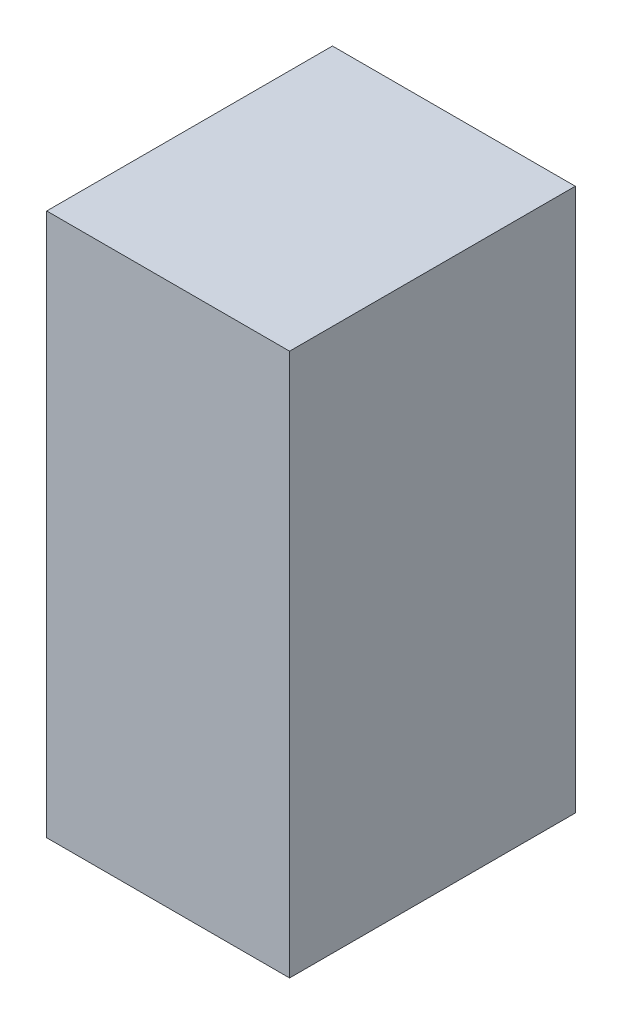
ISO-10303-21;
HEADER;
FILE_DESCRIPTION(('STEP AP214'),'2;1');
FILE_NAME('part.step','',(''),(''),'','','');
FILE_SCHEMA(('AUTOMOTIVE_DESIGN { 1 0 10303 214 1 1 1 1 }'));
ENDSEC;
DATA;
#1=APPLICATION_CONTEXT('core data for automotive mechanical design processes');
#2=APPLICATION_PROTOCOL_DEFINITION('international standard','automotive_design',2000,#1);
#3=PRODUCT_CONTEXT('',#1,'mechanical');
#4=PRODUCT('Part','Part','',(#3));
#5=PRODUCT_RELATED_PRODUCT_CATEGORY('part','',(#4));
#6=PRODUCT_DEFINITION_FORMATION('','',#4);
#7=PRODUCT_DEFINITION_CONTEXT('part definition',#1,'design');
#8=PRODUCT_DEFINITION('design','',#6,#7);
#9=PRODUCT_DEFINITION_SHAPE('','',#8);
#10=(LENGTH_UNIT() NAMED_UNIT(*) SI_UNIT(.MILLI.,.METRE.));
#11=(NAMED_UNIT(*) PLANE_ANGLE_UNIT() SI_UNIT($,.RADIAN.));
#12=(NAMED_UNIT(*) SI_UNIT($,.STERADIAN.) SOLID_ANGLE_UNIT());
#13=UNCERTAINTY_MEASURE_WITH_UNIT(LENGTH_MEASURE(1.E-05),#10,'distance_accuracy_value','');
#14=(GEOMETRIC_REPRESENTATION_CONTEXT(3) GLOBAL_UNCERTAINTY_ASSIGNED_CONTEXT((#13)) GLOBAL_UNIT_ASSIGNED_CONTEXT((#10,
#11,#12)) REPRESENTATION_CONTEXT('',''));
#15=CARTESIAN_POINT('',(0.,0.,0.));
#16=DIRECTION('',(0.,0.,1.));
#17=DIRECTION('',(1.,0.,0.));
#18=AXIS2_PLACEMENT_3D('',#15,#16,#17);
#19=CARTESIAN_POINT('',(0.0425000000000041,0.0950000000000074,0.1));
#20=DIRECTION('',(-1.,0.,0.));
#21=DIRECTION('',(0.,-1.,0.));
#22=AXIS2_PLACEMENT_3D('',#19,#20,#21);
#23=PLANE('',#22);
#24=DIRECTION('',(0.,1.,0.));
#25=VECTOR('',#24,1.);
#26=CARTESIAN_POINT('',(0.0425000000000041,0.0950000000000074,0.));
#27=LINE('',#26,#25);
#28=CARTESIAN_POINT('',(0.0425000000000041,-0.0950000000000074,0.));
#29=VERTEX_POINT('',#28);
#30=CARTESIAN_POINT('',(0.0425000000000041,0.0950000000000074,0.));
#31=VERTEX_POINT('',#30);
#32=EDGE_CURVE('E107',#29,#31,#27,.T.);
#33=ORIENTED_EDGE('',*,*,#32,.T.);
#34=DIRECTION('',(0.,0.,-1.));
#35=VECTOR('',#34,1.);
#36=CARTESIAN_POINT('',(0.0425000000000041,0.0950000000000074,0.1));
#37=LINE('',#36,#35);
#38=CARTESIAN_POINT('',(0.0425000000000041,0.0950000000000074,0.1));
#39=VERTEX_POINT('',#38);
#40=EDGE_CURVE('E11',#39,#31,#37,.T.);
#41=ORIENTED_EDGE('',*,*,#40,.F.);
#42=DIRECTION('',(0.,1.,0.));
#43=VECTOR('',#42,1.);
#44=CARTESIAN_POINT('',(0.0425000000000041,0.0950000000000074,0.1));
#45=LINE('',#44,#43);
#46=CARTESIAN_POINT('',(0.0425000000000041,-0.0950000000000074,0.1));
#47=VERTEX_POINT('',#46);
#48=EDGE_CURVE('E91',#47,#39,#45,.T.);
#49=ORIENTED_EDGE('',*,*,#48,.F.);
#50=DIRECTION('',(0.,0.,-1.));
#51=VECTOR('',#50,1.);
#52=CARTESIAN_POINT('',(0.0425000000000041,-0.0950000000000074,0.1));
#53=LINE('',#52,#51);
#54=EDGE_CURVE('E103',#47,#29,#53,.T.);
#55=ORIENTED_EDGE('',*,*,#54,.T.);
#56=EDGE_LOOP('',(#33,#41,#49,#55));
#57=FACE_BOUND('',#56,.T.);
#58=ADVANCED_FACE('F39',(#57),#23,.F.);
#59=CARTESIAN_POINT('',(-0.0425000000000041,0.0950000000000074,0.1));
#60=DIRECTION('',(0.,-1.,0.));
#61=DIRECTION('',(0.,0.,-1.));
#62=AXIS2_PLACEMENT_3D('',#59,#60,#61);
#63=PLANE('',#62);
#64=DIRECTION('',(-1.,0.,0.));
#65=VECTOR('',#64,1.);
#66=CARTESIAN_POINT('',(-0.0425000000000041,0.0950000000000074,0.));
#67=LINE('',#66,#65);
#68=CARTESIAN_POINT('',(-0.0425000000000041,0.0950000000000074,0.));
#69=VERTEX_POINT('',#68);
#70=EDGE_CURVE('E96',#31,#69,#67,.T.);
#71=ORIENTED_EDGE('',*,*,#70,.T.);
#72=DIRECTION('',(0.,0.,-1.));
#73=VECTOR('',#72,1.);
#74=CARTESIAN_POINT('',(-0.0425000000000041,0.0950000000000074,0.1));
#75=LINE('',#74,#73);
#76=CARTESIAN_POINT('',(-0.0425000000000041,0.0950000000000074,0.1));
#77=VERTEX_POINT('',#76);
#78=EDGE_CURVE('E48',#77,#69,#75,.T.);
#79=ORIENTED_EDGE('',*,*,#78,.F.);
#80=DIRECTION('',(-1.,0.,0.));
#81=VECTOR('',#80,1.);
#82=CARTESIAN_POINT('',(-0.0425000000000041,0.0950000000000074,0.1));
#83=LINE('',#82,#81);
#84=EDGE_CURVE('E86',#39,#77,#83,.T.);
#85=ORIENTED_EDGE('',*,*,#84,.F.);
#86=ORIENTED_EDGE('',*,*,#40,.T.);
#87=EDGE_LOOP('',(#71,#79,#85,#86));
#88=FACE_BOUND('',#87,.T.);
#89=ADVANCED_FACE('F95',(#88),#63,.F.);
#90=CARTESIAN_POINT('',(-0.0425000000000041,0.0950000000000074,0.1));
#91=DIRECTION('',(1.,0.,0.));
#92=DIRECTION('',(0.,1.,0.));
#93=AXIS2_PLACEMENT_3D('',#90,#91,#92);
#94=PLANE('',#93);
#95=DIRECTION('',(0.,-1.,0.));
#96=VECTOR('',#95,1.);
#97=CARTESIAN_POINT('',(-0.0425000000000041,0.0950000000000074,0.));
#98=LINE('',#97,#96);
#99=CARTESIAN_POINT('',(-0.0425000000000041,-0.0950000000000074,0.));
#100=VERTEX_POINT('',#99);
#101=EDGE_CURVE('E73',#69,#100,#98,.T.);
#102=ORIENTED_EDGE('',*,*,#101,.T.);
#103=DIRECTION('',(0.,0.,-1.));
#104=VECTOR('',#103,1.);
#105=CARTESIAN_POINT('',(-0.0425000000000041,-0.0950000000000074,0.1));
#106=LINE('',#105,#104);
#107=CARTESIAN_POINT('',(-0.0425000000000041,-0.0950000000000074,0.1));
#108=VERTEX_POINT('',#107);
#109=EDGE_CURVE('E98',#108,#100,#106,.T.);
#110=ORIENTED_EDGE('',*,*,#109,.F.);
#111=DIRECTION('',(0.,-1.,0.));
#112=VECTOR('',#111,1.);
#113=CARTESIAN_POINT('',(-0.0425000000000041,0.0950000000000074,0.1));
#114=LINE('',#113,#112);
#115=EDGE_CURVE('E89',#77,#108,#114,.T.);
#116=ORIENTED_EDGE('',*,*,#115,.F.);
#117=ORIENTED_EDGE('',*,*,#78,.T.);
#118=EDGE_LOOP('',(#102,#110,#116,#117));
#119=FACE_BOUND('',#118,.T.);
#120=ADVANCED_FACE('F99',(#119),#94,.F.);
#121=CARTESIAN_POINT('',(-0.0425000000000041,-0.0950000000000074,0.1));
#122=DIRECTION('',(0.,1.,0.));
#123=DIRECTION('',(0.,0.,1.));
#124=AXIS2_PLACEMENT_3D('',#121,#122,#123);
#125=PLANE('',#124);
#126=DIRECTION('',(1.,0.,0.));
#127=VECTOR('',#126,1.);
#128=CARTESIAN_POINT('',(-0.0425000000000041,-0.0950000000000074,0.));
#129=LINE('',#128,#127);
#130=EDGE_CURVE('E79',#100,#29,#129,.T.);
#131=ORIENTED_EDGE('',*,*,#130,.T.);
#132=ORIENTED_EDGE('',*,*,#54,.F.);
#133=DIRECTION('',(1.,0.,0.));
#134=VECTOR('',#133,1.);
#135=CARTESIAN_POINT('',(-0.0425000000000041,-0.0950000000000074,0.1));
#136=LINE('',#135,#134);
#137=EDGE_CURVE('E56',#108,#47,#136,.T.);
#138=ORIENTED_EDGE('',*,*,#137,.F.);
#139=ORIENTED_EDGE('',*,*,#109,.T.);
#140=EDGE_LOOP('',(#131,#132,#138,#139));
#141=FACE_BOUND('',#140,.T.);
#142=ADVANCED_FACE('F120',(#141),#125,.F.);
#143=CARTESIAN_POINT('',(0.,0.,0.1));
#144=DIRECTION('',(0.,0.,1.));
#145=DIRECTION('',(1.,0.,0.));
#146=AXIS2_PLACEMENT_3D('',#143,#144,#145);
#147=PLANE('',#146);
#148=ORIENTED_EDGE('',*,*,#48,.T.);
#149=ORIENTED_EDGE('',*,*,#84,.T.);
#150=ORIENTED_EDGE('',*,*,#115,.T.);
#151=ORIENTED_EDGE('',*,*,#137,.T.);
#152=EDGE_LOOP('',(#148,#149,#150,#151));
#153=FACE_BOUND('',#152,.T.);
#154=ADVANCED_FACE('F87',(#153),#147,.T.);
#155=CARTESIAN_POINT('',(0.,0.,0.));
#156=DIRECTION('',(0.,0.,1.));
#157=DIRECTION('',(1.,0.,0.));
#158=AXIS2_PLACEMENT_3D('',#155,#156,#157);
#159=PLANE('',#158);
#160=ORIENTED_EDGE('',*,*,#32,.F.);
#161=ORIENTED_EDGE('',*,*,#130,.F.);
#162=ORIENTED_EDGE('',*,*,#101,.F.);
#163=ORIENTED_EDGE('',*,*,#70,.F.);
#164=EDGE_LOOP('',(#160,#161,#162,#163));
#165=FACE_BOUND('',#164,.T.);
#166=ADVANCED_FACE('F123',(#165),#159,.F.);
#167=CLOSED_SHELL('',(#58,#89,#120,#142,#154,#166));
#168=MANIFOLD_SOLID_BREP('B2',#167);
#169=ADVANCED_BREP_SHAPE_REPRESENTATION('',(#18,#168),#14);
#170=SHAPE_DEFINITION_REPRESENTATION(#9,#169);
ENDSEC;
END-ISO-10303-21;
